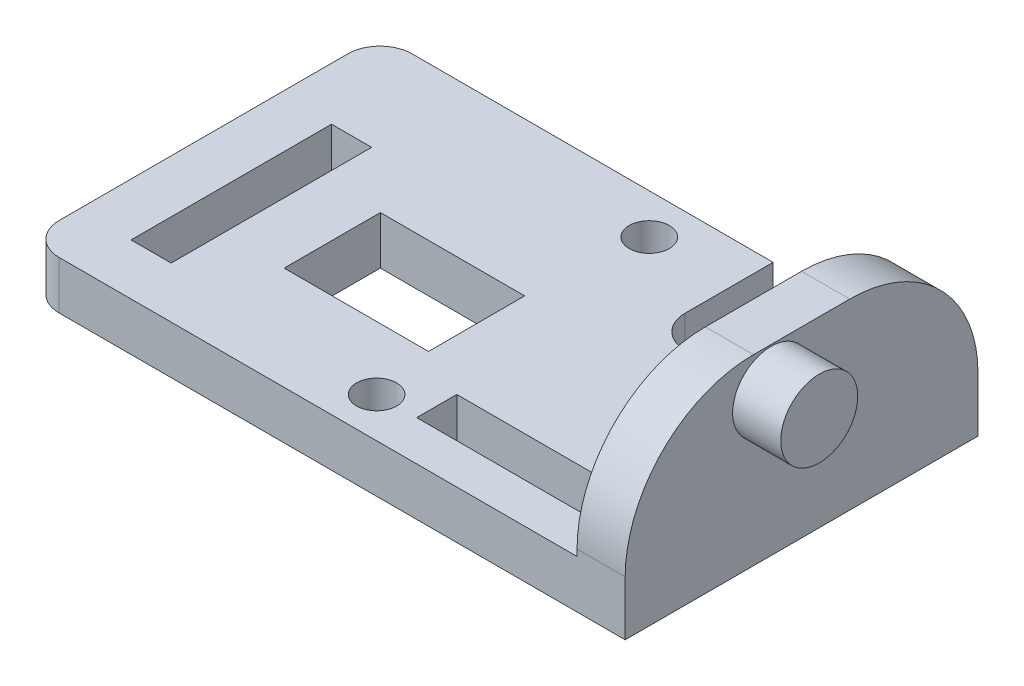
ISO-10303-21;
HEADER;
FILE_DESCRIPTION(('STEP AP214'),'2;1');
FILE_NAME('part.step','',(''),(''),'','','');
FILE_SCHEMA(('AUTOMOTIVE_DESIGN { 1 0 10303 214 1 1 1 1 }'));
ENDSEC;
DATA;
#1=APPLICATION_CONTEXT('core data for automotive mechanical design processes');
#2=APPLICATION_PROTOCOL_DEFINITION('international standard','automotive_design',2000,#1);
#3=PRODUCT_CONTEXT('',#1,'mechanical');
#4=PRODUCT('Part','Part','',(#3));
#5=PRODUCT_RELATED_PRODUCT_CATEGORY('part','',(#4));
#6=PRODUCT_DEFINITION_FORMATION('','',#4);
#7=PRODUCT_DEFINITION_CONTEXT('part definition',#1,'design');
#8=PRODUCT_DEFINITION('design','',#6,#7);
#9=PRODUCT_DEFINITION_SHAPE('','',#8);
#10=(LENGTH_UNIT() NAMED_UNIT(*) SI_UNIT(.MILLI.,.METRE.));
#11=(NAMED_UNIT(*) PLANE_ANGLE_UNIT() SI_UNIT($,.RADIAN.));
#12=(NAMED_UNIT(*) SI_UNIT($,.STERADIAN.) SOLID_ANGLE_UNIT());
#13=UNCERTAINTY_MEASURE_WITH_UNIT(LENGTH_MEASURE(1.E-05),#10,'distance_accuracy_value','');
#14=(GEOMETRIC_REPRESENTATION_CONTEXT(3) GLOBAL_UNCERTAINTY_ASSIGNED_CONTEXT((#13)) GLOBAL_UNIT_ASSIGNED_CONTEXT((#10,
#11,#12)) REPRESENTATION_CONTEXT('',''));
#15=CARTESIAN_POINT('',(0.,0.,0.));
#16=DIRECTION('',(0.,0.,1.));
#17=DIRECTION('',(1.,0.,0.));
#18=AXIS2_PLACEMENT_3D('',#15,#16,#17);
#19=CARTESIAN_POINT('',(0.,3.,0.));
#20=DIRECTION('',(0.,1.,0.));
#21=DIRECTION('',(0.,0.,1.));
#22=AXIS2_PLACEMENT_3D('',#19,#20,#21);
#23=PLANE('',#22);
#24=CARTESIAN_POINT('',(-19.2702207310731,3.,32.1300374848537));
#25=DIRECTION('',(0.,1.,0.));
#26=DIRECTION('',(0.,0.,1.));
#27=AXIS2_PLACEMENT_3D('',#24,#25,#26);
#28=CIRCLE('',#27,1.25);
#29=CARTESIAN_POINT('',(-19.2702207310731,3.,33.3800374848537));
#30=VERTEX_POINT('',#29);
#31=EDGE_CURVE('E872',#30,#30,#28,.F.);
#32=ORIENTED_EDGE('',*,*,#31,.T.);
#33=EDGE_LOOP('',(#32));
#34=FACE_BOUND('',#33,.T.);
#35=DIRECTION('',(0.,0.,1.));
#36=VECTOR('',#35,1.);
#37=CARTESIAN_POINT('',(-4.2702207310731,3.,0.));
#38=LINE('',#37,#36);
#39=CARTESIAN_POINT('',(-4.2702207310731,3.,18.1214427198825));
#40=VERTEX_POINT('',#39);
#41=CARTESIAN_POINT('',(-4.2702207310731,3.,29.6300374848537));
#42=VERTEX_POINT('',#41);
#43=EDGE_CURVE('E378',#40,#42,#38,.T.);
#44=ORIENTED_EDGE('',*,*,#43,.F.);
#45=CARTESIAN_POINT('',(-6.2702207310731,3.,18.1214427198825));
#46=DIRECTION('',(0.,1.,0.));
#47=DIRECTION('',(0.,0.,1.));
#48=AXIS2_PLACEMENT_3D('',#45,#46,#47);
#49=CIRCLE('',#48,2.);
#50=CARTESIAN_POINT('',(-6.2702207310731,3.,20.1214427198825));
#51=VERTEX_POINT('',#50);
#52=EDGE_CURVE('E342',#40,#51,#49,.F.);
#53=ORIENTED_EDGE('',*,*,#52,.T.);
#54=DIRECTION('',(-1.,0.,0.));
#55=VECTOR('',#54,1.);
#56=CARTESIAN_POINT('',(0.,3.,20.1214427198825));
#57=LINE('',#56,#55);
#58=CARTESIAN_POINT('',(-12.0414444487504,3.,20.1214427198825));
#59=VERTEX_POINT('',#58);
#60=EDGE_CURVE('E396',#51,#59,#57,.T.);
#61=ORIENTED_EDGE('',*,*,#60,.T.);
#62=CARTESIAN_POINT('',(-12.0414444487504,3.,18.1214427198825));
#63=DIRECTION('',(0.,1.,0.));
#64=DIRECTION('',(0.,0.,1.));
#65=AXIS2_PLACEMENT_3D('',#62,#63,#64);
#66=CIRCLE('',#65,2.);
#67=CARTESIAN_POINT('',(-14.0414444487504,3.,18.1214427198825));
#68=VERTEX_POINT('',#67);
#69=EDGE_CURVE('E346',#59,#68,#66,.F.);
#70=ORIENTED_EDGE('',*,*,#69,.T.);
#71=DIRECTION('',(0.,0.,1.));
#72=VECTOR('',#71,1.);
#73=CARTESIAN_POINT('',(-14.0414444487504,3.,0.));
#74=LINE('',#73,#72);
#75=CARTESIAN_POINT('',(-14.0414444487504,3.,12.6300374848537));
#76=VERTEX_POINT('',#75);
#77=EDGE_CURVE('E399',#76,#68,#74,.T.);
#78=ORIENTED_EDGE('',*,*,#77,.F.);
#79=DIRECTION('',(1.,0.,0.));
#80=VECTOR('',#79,1.);
#81=CARTESIAN_POINT('',(0.,3.,12.6300374848537));
#82=LINE('',#81,#80);
#83=CARTESIAN_POINT('',(-36.561763485987,3.,12.6300374848537));
#84=VERTEX_POINT('',#83);
#85=EDGE_CURVE('E388',#84,#76,#82,.T.);
#86=ORIENTED_EDGE('',*,*,#85,.F.);
#87=CARTESIAN_POINT('',(-36.561763485987,3.,14.6300374848537));
#88=DIRECTION('',(0.,1.,0.));
#89=DIRECTION('',(0.,0.,1.));
#90=AXIS2_PLACEMENT_3D('',#87,#88,#89);
#91=CIRCLE('',#90,2.);
#92=CARTESIAN_POINT('',(-38.561763485987,3.,14.6300374848537));
#93=VERTEX_POINT('',#92);
#94=EDGE_CURVE('E337',#84,#93,#91,.T.);
#95=ORIENTED_EDGE('',*,*,#94,.T.);
#96=DIRECTION('',(0.,0.,1.));
#97=VECTOR('',#96,1.);
#98=CARTESIAN_POINT('',(-38.561763485987,3.,0.));
#99=LINE('',#98,#97);
#100=CARTESIAN_POINT('',(-38.561763485987,3.,32.6300374848537));
#101=VERTEX_POINT('',#100);
#102=EDGE_CURVE('E390',#93,#101,#99,.T.);
#103=ORIENTED_EDGE('',*,*,#102,.T.);
#104=CARTESIAN_POINT('',(-36.561763485987,3.,32.6300374848537));
#105=DIRECTION('',(0.,1.,0.));
#106=DIRECTION('',(0.,0.,1.));
#107=AXIS2_PLACEMENT_3D('',#104,#105,#106);
#108=CIRCLE('',#107,2.);
#109=CARTESIAN_POINT('',(-36.561763485987,3.,34.6300374848537));
#110=VERTEX_POINT('',#109);
#111=EDGE_CURVE('E335',#101,#110,#108,.T.);
#112=ORIENTED_EDGE('',*,*,#111,.T.);
#113=DIRECTION('',(1.,0.,0.));
#114=VECTOR('',#113,1.);
#115=CARTESIAN_POINT('',(0.,3.,34.6300374848537));
#116=LINE('',#115,#114);
#117=CARTESIAN_POINT('',(-4.2702207310731,3.,34.6300374848537));
#118=VERTEX_POINT('',#117);
#119=EDGE_CURVE('E393',#110,#118,#116,.T.);
#120=ORIENTED_EDGE('',*,*,#119,.T.);
#121=CARTESIAN_POINT('',(-4.2702207310731,3.,32.1300374848537));
#122=VERTEX_POINT('',#121);
#123=EDGE_CURVE('E380',#122,#118,#38,.T.);
#124=ORIENTED_EDGE('',*,*,#123,.F.);
#125=DIRECTION('',(1.,0.,0.));
#126=VECTOR('',#125,1.);
#127=CARTESIAN_POINT('',(0.,3.,32.1300374848537));
#128=LINE('',#127,#126);
#129=CARTESIAN_POINT('',(-16.7702207310731,3.,32.1300374848537));
#130=VERTEX_POINT('',#129);
#131=EDGE_CURVE('E277',#130,#122,#128,.T.);
#132=ORIENTED_EDGE('',*,*,#131,.F.);
#133=DIRECTION('',(0.,0.,-1.));
#134=VECTOR('',#133,1.);
#135=CARTESIAN_POINT('',(-16.7702207310731,3.,0.));
#136=LINE('',#135,#134);
#137=CARTESIAN_POINT('',(-16.7702207310731,3.,29.6300374848537));
#138=VERTEX_POINT('',#137);
#139=EDGE_CURVE('E383',#130,#138,#136,.T.);
#140=ORIENTED_EDGE('',*,*,#139,.T.);
#141=DIRECTION('',(1.,0.,0.));
#142=VECTOR('',#141,1.);
#143=CARTESIAN_POINT('',(0.,3.,29.6300374848537));
#144=LINE('',#143,#142);
#145=EDGE_CURVE('E385',#138,#42,#144,.T.);
#146=ORIENTED_EDGE('',*,*,#145,.T.);
#147=EDGE_LOOP('',(#44,#53,#61,#70,#78,#86,#95,#103,#112,#120,#124,#132,#140,#146));
#148=FACE_BOUND('',#147,.T.);
#149=DIRECTION('',(1.,0.,0.));
#150=VECTOR('',#149,1.);
#151=CARTESIAN_POINT('',(0.,3.,18.9400374848537));
#152=LINE('',#151,#150);
#153=CARTESIAN_POINT('',(-35.2702207310731,3.,18.9400374848537));
#154=VERTEX_POINT('',#153);
#155=CARTESIAN_POINT('',(-32.7702207310731,3.,18.9400374848537));
#156=VERTEX_POINT('',#155);
#157=EDGE_CURVE('E402',#154,#156,#152,.T.);
#158=ORIENTED_EDGE('',*,*,#157,.T.);
#159=DIRECTION('',(0.,0.,1.));
#160=VECTOR('',#159,1.);
#161=CARTESIAN_POINT('',(-32.7702207310731,3.,0.));
#162=LINE('',#161,#160);
#163=CARTESIAN_POINT('',(-32.7702207310731,3.,31.4400374848537));
#164=VERTEX_POINT('',#163);
#165=EDGE_CURVE('E405',#156,#164,#162,.T.);
#166=ORIENTED_EDGE('',*,*,#165,.T.);
#167=DIRECTION('',(1.,0.,0.));
#168=VECTOR('',#167,1.);
#169=CARTESIAN_POINT('',(0.,3.,31.4400374848537));
#170=LINE('',#169,#168);
#171=CARTESIAN_POINT('',(-35.2702207310731,3.,31.4400374848537));
#172=VERTEX_POINT('',#171);
#173=EDGE_CURVE('E407',#172,#164,#170,.T.);
#174=ORIENTED_EDGE('',*,*,#173,.F.);
#175=DIRECTION('',(0.,0.,1.));
#176=VECTOR('',#175,1.);
#177=CARTESIAN_POINT('',(-35.2702207310731,3.,0.));
#178=LINE('',#177,#176);
#179=EDGE_CURVE('E410',#154,#172,#178,.T.);
#180=ORIENTED_EDGE('',*,*,#179,.F.);
#181=EDGE_LOOP('',(#158,#166,#174,#180));
#182=FACE_BOUND('',#181,.T.);
#183=DIRECTION('',(0.,0.,-1.));
#184=VECTOR('',#183,1.);
#185=CARTESIAN_POINT('',(-19.9759075065072,3.,0.));
#186=LINE('',#185,#184);
#187=CARTESIAN_POINT('',(-19.9759075065072,3.,28.1900374848538));
#188=VERTEX_POINT('',#187);
#189=CARTESIAN_POINT('',(-19.9759075065072,3.,22.1900374848537));
#190=VERTEX_POINT('',#189);
#191=EDGE_CURVE('E413',#188,#190,#186,.T.);
#192=ORIENTED_EDGE('',*,*,#191,.F.);
#193=DIRECTION('',(1.,0.,0.));
#194=VECTOR('',#193,1.);
#195=CARTESIAN_POINT('',(0.,3.,28.1900374848538));
#196=LINE('',#195,#194);
#197=CARTESIAN_POINT('',(-28.9759075065072,3.,28.1900374848537));
#198=VERTEX_POINT('',#197);
#199=EDGE_CURVE('E416',#198,#188,#196,.T.);
#200=ORIENTED_EDGE('',*,*,#199,.F.);
#201=DIRECTION('',(0.,0.,-1.));
#202=VECTOR('',#201,1.);
#203=CARTESIAN_POINT('',(-28.9759075065072,3.,0.));
#204=LINE('',#203,#202);
#205=CARTESIAN_POINT('',(-28.9759075065072,3.,22.1900374848537));
#206=VERTEX_POINT('',#205);
#207=EDGE_CURVE('E419',#198,#206,#204,.T.);
#208=ORIENTED_EDGE('',*,*,#207,.T.);
#209=DIRECTION('',(1.,0.,0.));
#210=VECTOR('',#209,1.);
#211=CARTESIAN_POINT('',(0.,3.,22.1900374848537));
#212=LINE('',#211,#210);
#213=EDGE_CURVE('E308',#206,#190,#212,.T.);
#214=ORIENTED_EDGE('',*,*,#213,.T.);
#215=EDGE_LOOP('',(#192,#200,#208,#214));
#216=FACE_BOUND('',#215,.T.);
#217=CARTESIAN_POINT('',(-19.2702207310731,3.,15.1300374848537));
#218=DIRECTION('',(0.,1.,0.));
#219=DIRECTION('',(0.,0.,1.));
#220=AXIS2_PLACEMENT_3D('',#217,#218,#219);
#221=CIRCLE('',#220,1.25);
#222=CARTESIAN_POINT('',(-19.2702207310731,3.,16.3800374848537));
#223=VERTEX_POINT('',#222);
#224=EDGE_CURVE('E861',#223,#223,#221,.F.);
#225=ORIENTED_EDGE('',*,*,#224,.T.);
#226=EDGE_LOOP('',(#225));
#227=FACE_BOUND('',#226,.T.);
#228=ADVANCED_FACE('F34',(#34,#148,#182,#216,#227),#23,.T.);
#229=CARTESIAN_POINT('',(0.,0.,0.));
#230=DIRECTION('',(0.,1.,0.));
#231=DIRECTION('',(0.,0.,1.));
#232=AXIS2_PLACEMENT_3D('',#229,#230,#231);
#233=PLANE('',#232);
#234=CARTESIAN_POINT('',(-19.2702207310731,0.,32.1300374848537));
#235=DIRECTION('',(0.,1.,0.));
#236=DIRECTION('',(0.,0.,1.));
#237=AXIS2_PLACEMENT_3D('',#234,#235,#236);
#238=CIRCLE('',#237,1.25);
#239=CARTESIAN_POINT('',(-19.2702207310731,0.,33.3800374848537));
#240=VERTEX_POINT('',#239);
#241=EDGE_CURVE('E867',#240,#240,#238,.T.);
#242=ORIENTED_EDGE('',*,*,#241,.T.);
#243=EDGE_LOOP('',(#242));
#244=FACE_BOUND('',#243,.T.);
#245=DIRECTION('',(0.,0.,-1.));
#246=VECTOR('',#245,1.);
#247=CARTESIAN_POINT('',(-4.2702207310731,0.,0.));
#248=LINE('',#247,#246);
#249=CARTESIAN_POINT('',(-4.2702207310731,0.,32.1300374848537));
#250=VERTEX_POINT('',#249);
#251=CARTESIAN_POINT('',(-4.2702207310731,0.,29.6300374848537));
#252=VERTEX_POINT('',#251);
#253=EDGE_CURVE('E431',#250,#252,#248,.T.);
#254=ORIENTED_EDGE('',*,*,#253,.T.);
#255=DIRECTION('',(1.,0.,0.));
#256=VECTOR('',#255,1.);
#257=CARTESIAN_POINT('',(0.,0.,29.6300374848537));
#258=LINE('',#257,#256);
#259=CARTESIAN_POINT('',(-16.7702207310731,0.,29.6300374848537));
#260=VERTEX_POINT('',#259);
#261=EDGE_CURVE('E428',#260,#252,#258,.T.);
#262=ORIENTED_EDGE('',*,*,#261,.F.);
#263=DIRECTION('',(0.,0.,-1.));
#264=VECTOR('',#263,1.);
#265=CARTESIAN_POINT('',(-16.7702207310731,0.,0.));
#266=LINE('',#265,#264);
#267=CARTESIAN_POINT('',(-16.7702207310731,0.,32.1300374848537));
#268=VERTEX_POINT('',#267);
#269=EDGE_CURVE('E426',#268,#260,#266,.T.);
#270=ORIENTED_EDGE('',*,*,#269,.F.);
#271=DIRECTION('',(1.,0.,0.));
#272=VECTOR('',#271,1.);
#273=CARTESIAN_POINT('',(0.,0.,32.1300374848537));
#274=LINE('',#273,#272);
#275=EDGE_CURVE('E423',#268,#250,#274,.T.);
#276=ORIENTED_EDGE('',*,*,#275,.T.);
#277=EDGE_LOOP('',(#254,#262,#270,#276));
#278=FACE_BOUND('',#277,.T.);
#279=CARTESIAN_POINT('',(-6.2702207310731,0.,18.1214427198825));
#280=DIRECTION('',(0.,1.,0.));
#281=DIRECTION('',(0.,0.,1.));
#282=AXIS2_PLACEMENT_3D('',#279,#280,#281);
#283=CIRCLE('',#282,2.);
#284=CARTESIAN_POINT('',(-6.2702207310731,0.,20.1214427198825));
#285=VERTEX_POINT('',#284);
#286=CARTESIAN_POINT('',(-4.2702207310731,0.,18.1214427198825));
#287=VERTEX_POINT('',#286);
#288=EDGE_CURVE('E340',#285,#287,#283,.T.);
#289=ORIENTED_EDGE('',*,*,#288,.T.);
#290=DIRECTION('',(0.,0.,-1.));
#291=VECTOR('',#290,1.);
#292=CARTESIAN_POINT('',(-4.2702207310731,0.,0.));
#293=LINE('',#292,#291);
#294=CARTESIAN_POINT('',(-4.2702207310731,0.,12.6300374848537));
#295=VERTEX_POINT('',#294);
#296=EDGE_CURVE('E242',#287,#295,#293,.T.);
#297=ORIENTED_EDGE('',*,*,#296,.T.);
#298=DIRECTION('',(1.,0.,0.));
#299=VECTOR('',#298,1.);
#300=CARTESIAN_POINT('',(0.,0.,12.6300374848537));
#301=LINE('',#300,#299);
#302=CARTESIAN_POINT('',(-1.2702207310731,0.,12.6300374848537));
#303=VERTEX_POINT('',#302);
#304=EDGE_CURVE('E240',#295,#303,#301,.T.);
#305=ORIENTED_EDGE('',*,*,#304,.T.);
#306=DIRECTION('',(0.,0.,1.));
#307=VECTOR('',#306,1.);
#308=CARTESIAN_POINT('',(-1.2702207310731,0.,0.));
#309=LINE('',#308,#307);
#310=CARTESIAN_POINT('',(-1.2702207310731,0.,34.6300374848537));
#311=VERTEX_POINT('',#310);
#312=EDGE_CURVE('E219',#303,#311,#309,.T.);
#313=ORIENTED_EDGE('',*,*,#312,.T.);
#314=DIRECTION('',(1.,0.,0.));
#315=VECTOR('',#314,1.);
#316=CARTESIAN_POINT('',(0.,0.,34.6300374848537));
#317=LINE('',#316,#315);
#318=CARTESIAN_POINT('',(-36.561763485987,0.,34.6300374848537));
#319=VERTEX_POINT('',#318);
#320=EDGE_CURVE('E228',#319,#311,#317,.T.);
#321=ORIENTED_EDGE('',*,*,#320,.F.);
#322=CARTESIAN_POINT('',(-36.561763485987,0.,32.6300374848537));
#323=DIRECTION('',(0.,1.,0.));
#324=DIRECTION('',(0.,0.,1.));
#325=AXIS2_PLACEMENT_3D('',#322,#323,#324);
#326=CIRCLE('',#325,2.);
#327=CARTESIAN_POINT('',(-38.561763485987,0.,32.6300374848537));
#328=VERTEX_POINT('',#327);
#329=EDGE_CURVE('E329',#319,#328,#326,.F.);
#330=ORIENTED_EDGE('',*,*,#329,.T.);
#331=DIRECTION('',(0.,0.,1.));
#332=VECTOR('',#331,1.);
#333=CARTESIAN_POINT('',(-38.561763485987,0.,0.));
#334=LINE('',#333,#332);
#335=CARTESIAN_POINT('',(-38.561763485987,0.,14.6300374848537));
#336=VERTEX_POINT('',#335);
#337=EDGE_CURVE('E234',#336,#328,#334,.T.);
#338=ORIENTED_EDGE('',*,*,#337,.F.);
#339=CARTESIAN_POINT('',(-36.561763485987,0.,14.6300374848537));
#340=DIRECTION('',(0.,1.,0.));
#341=DIRECTION('',(0.,0.,1.));
#342=AXIS2_PLACEMENT_3D('',#339,#340,#341);
#343=CIRCLE('',#342,2.);
#344=CARTESIAN_POINT('',(-36.561763485987,0.,12.6300374848537));
#345=VERTEX_POINT('',#344);
#346=EDGE_CURVE('E331',#336,#345,#343,.F.);
#347=ORIENTED_EDGE('',*,*,#346,.T.);
#348=DIRECTION('',(1.,0.,0.));
#349=VECTOR('',#348,1.);
#350=CARTESIAN_POINT('',(0.,0.,12.6300374848537));
#351=LINE('',#350,#349);
#352=CARTESIAN_POINT('',(-14.0414444487504,0.,12.6300374848537));
#353=VERTEX_POINT('',#352);
#354=EDGE_CURVE('E434',#345,#353,#351,.T.);
#355=ORIENTED_EDGE('',*,*,#354,.T.);
#356=DIRECTION('',(0.,0.,1.));
#357=VECTOR('',#356,1.);
#358=CARTESIAN_POINT('',(-14.0414444487504,0.,0.));
#359=LINE('',#358,#357);
#360=CARTESIAN_POINT('',(-14.0414444487504,0.,18.1214427198825));
#361=VERTEX_POINT('',#360);
#362=EDGE_CURVE('E250',#353,#361,#359,.T.);
#363=ORIENTED_EDGE('',*,*,#362,.T.);
#364=CARTESIAN_POINT('',(-12.0414444487504,0.,18.1214427198825));
#365=DIRECTION('',(0.,1.,0.));
#366=DIRECTION('',(0.,0.,1.));
#367=AXIS2_PLACEMENT_3D('',#364,#365,#366);
#368=CIRCLE('',#367,2.);
#369=CARTESIAN_POINT('',(-12.0414444487504,0.,20.1214427198825));
#370=VERTEX_POINT('',#369);
#371=EDGE_CURVE('E344',#361,#370,#368,.T.);
#372=ORIENTED_EDGE('',*,*,#371,.T.);
#373=DIRECTION('',(-1.,0.,0.));
#374=VECTOR('',#373,1.);
#375=CARTESIAN_POINT('',(0.,0.,20.1214427198825));
#376=LINE('',#375,#374);
#377=EDGE_CURVE('E247',#285,#370,#376,.T.);
#378=ORIENTED_EDGE('',*,*,#377,.F.);
#379=EDGE_LOOP('',(#289,#297,#305,#313,#321,#330,#338,#347,#355,#363,#372,#378));
#380=FACE_BOUND('',#379,.T.);
#381=DIRECTION('',(1.,0.,0.));
#382=VECTOR('',#381,1.);
#383=CARTESIAN_POINT('',(0.,0.,18.9400374848537));
#384=LINE('',#383,#382);
#385=CARTESIAN_POINT('',(-35.2702207310731,0.,18.9400374848537));
#386=VERTEX_POINT('',#385);
#387=CARTESIAN_POINT('',(-32.7702207310731,0.,18.9400374848537));
#388=VERTEX_POINT('',#387);
#389=EDGE_CURVE('E253',#386,#388,#384,.T.);
#390=ORIENTED_EDGE('',*,*,#389,.F.);
#391=DIRECTION('',(0.,0.,1.));
#392=VECTOR('',#391,1.);
#393=CARTESIAN_POINT('',(-35.2702207310731,0.,0.));
#394=LINE('',#393,#392);
#395=CARTESIAN_POINT('',(-35.2702207310731,0.,31.4400374848537));
#396=VERTEX_POINT('',#395);
#397=EDGE_CURVE('E262',#386,#396,#394,.T.);
#398=ORIENTED_EDGE('',*,*,#397,.T.);
#399=DIRECTION('',(1.,0.,0.));
#400=VECTOR('',#399,1.);
#401=CARTESIAN_POINT('',(0.,0.,31.4400374848537));
#402=LINE('',#401,#400);
#403=CARTESIAN_POINT('',(-32.7702207310731,0.,31.4400374848537));
#404=VERTEX_POINT('',#403);
#405=EDGE_CURVE('E259',#396,#404,#402,.T.);
#406=ORIENTED_EDGE('',*,*,#405,.T.);
#407=DIRECTION('',(0.,0.,1.));
#408=VECTOR('',#407,1.);
#409=CARTESIAN_POINT('',(-32.7702207310731,0.,0.));
#410=LINE('',#409,#408);
#411=EDGE_CURVE('E256',#388,#404,#410,.T.);
#412=ORIENTED_EDGE('',*,*,#411,.F.);
#413=EDGE_LOOP('',(#390,#398,#406,#412));
#414=FACE_BOUND('',#413,.T.);
#415=DIRECTION('',(0.,0.,-1.));
#416=VECTOR('',#415,1.);
#417=CARTESIAN_POINT('',(-19.9759075065072,0.,0.));
#418=LINE('',#417,#416);
#419=CARTESIAN_POINT('',(-19.9759075065072,0.,28.1900374848538));
#420=VERTEX_POINT('',#419);
#421=CARTESIAN_POINT('',(-19.9759075065072,0.,22.1900374848537));
#422=VERTEX_POINT('',#421);
#423=EDGE_CURVE('E265',#420,#422,#418,.T.);
#424=ORIENTED_EDGE('',*,*,#423,.T.);
#425=DIRECTION('',(1.,0.,0.));
#426=VECTOR('',#425,1.);
#427=CARTESIAN_POINT('',(0.,0.,22.1900374848537));
#428=LINE('',#427,#426);
#429=CARTESIAN_POINT('',(-28.9759075065072,0.,22.1900374848537));
#430=VERTEX_POINT('',#429);
#431=EDGE_CURVE('E274',#430,#422,#428,.T.);
#432=ORIENTED_EDGE('',*,*,#431,.F.);
#433=DIRECTION('',(0.,0.,-1.));
#434=VECTOR('',#433,1.);
#435=CARTESIAN_POINT('',(-28.9759075065072,0.,0.));
#436=LINE('',#435,#434);
#437=CARTESIAN_POINT('',(-28.9759075065072,0.,28.1900374848537));
#438=VERTEX_POINT('',#437);
#439=EDGE_CURVE('E271',#438,#430,#436,.T.);
#440=ORIENTED_EDGE('',*,*,#439,.F.);
#441=DIRECTION('',(1.,0.,0.));
#442=VECTOR('',#441,1.);
#443=CARTESIAN_POINT('',(0.,0.,28.1900374848538));
#444=LINE('',#443,#442);
#445=EDGE_CURVE('E268',#438,#420,#444,.T.);
#446=ORIENTED_EDGE('',*,*,#445,.T.);
#447=EDGE_LOOP('',(#424,#432,#440,#446));
#448=FACE_BOUND('',#447,.T.);
#449=CARTESIAN_POINT('',(-19.2702207310731,0.,15.1300374848537));
#450=DIRECTION('',(0.,1.,0.));
#451=DIRECTION('',(0.,0.,1.));
#452=AXIS2_PLACEMENT_3D('',#449,#450,#451);
#453=CIRCLE('',#452,1.25);
#454=CARTESIAN_POINT('',(-19.2702207310731,0.,16.3800374848537));
#455=VERTEX_POINT('',#454);
#456=EDGE_CURVE('E864',#455,#455,#453,.T.);
#457=ORIENTED_EDGE('',*,*,#456,.T.);
#458=EDGE_LOOP('',(#457));
#459=FACE_BOUND('',#458,.T.);
#460=ADVANCED_FACE('F236',(#244,#278,#380,#414,#448,#459),#233,.F.);
#461=CARTESIAN_POINT('',(-1.2702207310731,3.,0.));
#462=DIRECTION('',(1.,0.,0.));
#463=DIRECTION('',(0.,0.,-1.));
#464=AXIS2_PLACEMENT_3D('',#461,#462,#463);
#465=PLANE('',#464);
#466=DIRECTION('',(0.,-1.,0.));
#467=VECTOR('',#466,1.);
#468=CARTESIAN_POINT('',(-1.2702207310731,3.,12.6300374848537));
#469=LINE('',#468,#467);
#470=CARTESIAN_POINT('',(-1.2702207310731,3.4,12.6300374848537));
#471=VERTEX_POINT('',#470);
#472=EDGE_CURVE('E292',#471,#303,#469,.T.);
#473=ORIENTED_EDGE('',*,*,#472,.F.);
#474=CARTESIAN_POINT('',(-1.2702207310731,3.4,20.6300374848537));
#475=DIRECTION('',(1.,0.,0.));
#476=DIRECTION('',(0.,0.,-1.));
#477=AXIS2_PLACEMENT_3D('',#474,#475,#476);
#478=CIRCLE('',#477,8.);
#479=CARTESIAN_POINT('',(-1.2702207310731,11.4,20.6300374848537));
#480=VERTEX_POINT('',#479);
#481=EDGE_CURVE('E352',#471,#480,#478,.T.);
#482=ORIENTED_EDGE('',*,*,#481,.T.);
#483=DIRECTION('',(0.,0.,1.));
#484=VECTOR('',#483,1.);
#485=CARTESIAN_POINT('',(-1.2702207310731,11.4,0.));
#486=LINE('',#485,#484);
#487=CARTESIAN_POINT('',(-1.2702207310731,11.4,26.6300374848537));
#488=VERTEX_POINT('',#487);
#489=EDGE_CURVE('E224',#480,#488,#486,.T.);
#490=ORIENTED_EDGE('',*,*,#489,.T.);
#491=CARTESIAN_POINT('',(-1.2702207310731,3.4,26.6300374848537));
#492=DIRECTION('',(1.,0.,0.));
#493=DIRECTION('',(0.,0.,-1.));
#494=AXIS2_PLACEMENT_3D('',#491,#492,#493);
#495=CIRCLE('',#494,8.);
#496=CARTESIAN_POINT('',(-1.2702207310731,3.4,34.6300374848537));
#497=VERTEX_POINT('',#496);
#498=EDGE_CURVE('E222',#488,#497,#495,.T.);
#499=ORIENTED_EDGE('',*,*,#498,.T.);
#500=DIRECTION('',(0.,-1.,0.));
#501=VECTOR('',#500,1.);
#502=CARTESIAN_POINT('',(-1.2702207310731,11.4,34.6300374848537));
#503=LINE('',#502,#501);
#504=EDGE_CURVE('E213',#497,#311,#503,.T.);
#505=ORIENTED_EDGE('',*,*,#504,.T.);
#506=ORIENTED_EDGE('',*,*,#312,.F.);
#507=EDGE_LOOP('',(#473,#482,#490,#499,#505,#506));
#508=FACE_BOUND('',#507,.T.);
#509=CARTESIAN_POINT('',(-1.2702207310731,8.9,25.5300374848537));
#510=DIRECTION('',(1.,0.,0.));
#511=DIRECTION('',(0.,0.,-1.));
#512=AXIS2_PLACEMENT_3D('',#509,#510,#511);
#513=CIRCLE('',#512,2.4);
#514=CARTESIAN_POINT('',(-1.2702207310731,8.9,23.1300374848537));
#515=VERTEX_POINT('',#514);
#516=EDGE_CURVE('E874',#515,#515,#513,.T.);
#517=ORIENTED_EDGE('',*,*,#516,.F.);
#518=EDGE_LOOP('',(#517));
#519=FACE_BOUND('',#518,.T.);
#520=ADVANCED_FACE('F216',(#508,#519),#465,.T.);
#521=CARTESIAN_POINT('',(-19.9759075065072,3.,0.));
#522=DIRECTION('',(-1.,0.,0.));
#523=DIRECTION('',(0.,0.,1.));
#524=AXIS2_PLACEMENT_3D('',#521,#522,#523);
#525=PLANE('',#524);
#526=ORIENTED_EDGE('',*,*,#423,.F.);
#527=DIRECTION('',(0.,-1.,0.));
#528=VECTOR('',#527,1.);
#529=CARTESIAN_POINT('',(-19.9759075065072,3.,28.1900374848538));
#530=LINE('',#529,#528);
#531=EDGE_CURVE('E286',#188,#420,#530,.T.);
#532=ORIENTED_EDGE('',*,*,#531,.F.);
#533=ORIENTED_EDGE('',*,*,#191,.T.);
#534=DIRECTION('',(0.,-1.,0.));
#535=VECTOR('',#534,1.);
#536=CARTESIAN_POINT('',(-19.9759075065072,3.,22.1900374848537));
#537=LINE('',#536,#535);
#538=EDGE_CURVE('E278',#190,#422,#537,.T.);
#539=ORIENTED_EDGE('',*,*,#538,.T.);
#540=EDGE_LOOP('',(#526,#532,#533,#539));
#541=FACE_BOUND('',#540,.T.);
#542=ADVANCED_FACE('F528',(#541),#525,.T.);
#543=CARTESIAN_POINT('',(0.,3.,28.1900374848538));
#544=DIRECTION('',(0.,0.,-1.));
#545=DIRECTION('',(-1.,0.,0.));
#546=AXIS2_PLACEMENT_3D('',#543,#544,#545);
#547=PLANE('',#546);
#548=ORIENTED_EDGE('',*,*,#445,.F.);
#549=DIRECTION('',(0.,-1.,0.));
#550=VECTOR('',#549,1.);
#551=CARTESIAN_POINT('',(-28.9759075065072,3.,28.1900374848537));
#552=LINE('',#551,#550);
#553=EDGE_CURVE('E284',#198,#438,#552,.T.);
#554=ORIENTED_EDGE('',*,*,#553,.F.);
#555=ORIENTED_EDGE('',*,*,#199,.T.);
#556=ORIENTED_EDGE('',*,*,#531,.T.);
#557=EDGE_LOOP('',(#548,#554,#555,#556));
#558=FACE_BOUND('',#557,.T.);
#559=ADVANCED_FACE('F524',(#558),#547,.T.);
#560=CARTESIAN_POINT('',(-28.9759075065072,3.,0.));
#561=DIRECTION('',(-1.,0.,0.));
#562=DIRECTION('',(0.,0.,1.));
#563=AXIS2_PLACEMENT_3D('',#560,#561,#562);
#564=PLANE('',#563);
#565=ORIENTED_EDGE('',*,*,#439,.T.);
#566=DIRECTION('',(0.,-1.,0.));
#567=VECTOR('',#566,1.);
#568=CARTESIAN_POINT('',(-28.9759075065072,3.,22.1900374848537));
#569=LINE('',#568,#567);
#570=EDGE_CURVE('E280',#206,#430,#569,.T.);
#571=ORIENTED_EDGE('',*,*,#570,.F.);
#572=ORIENTED_EDGE('',*,*,#207,.F.);
#573=ORIENTED_EDGE('',*,*,#553,.T.);
#574=EDGE_LOOP('',(#565,#571,#572,#573));
#575=FACE_BOUND('',#574,.T.);
#576=ADVANCED_FACE('F520',(#575),#564,.F.);
#577=CARTESIAN_POINT('',(0.,3.,18.9400374848537));
#578=DIRECTION('',(0.,0.,-1.));
#579=DIRECTION('',(-1.,0.,0.));
#580=AXIS2_PLACEMENT_3D('',#577,#578,#579);
#581=PLANE('',#580);
#582=ORIENTED_EDGE('',*,*,#389,.T.);
#583=DIRECTION('',(0.,-1.,0.));
#584=VECTOR('',#583,1.);
#585=CARTESIAN_POINT('',(-32.7702207310731,3.,18.9400374848537));
#586=LINE('',#585,#584);
#587=EDGE_CURVE('E281',#156,#388,#586,.T.);
#588=ORIENTED_EDGE('',*,*,#587,.F.);
#589=ORIENTED_EDGE('',*,*,#157,.F.);
#590=DIRECTION('',(0.,-1.,0.));
#591=VECTOR('',#590,1.);
#592=CARTESIAN_POINT('',(-35.2702207310731,3.,18.9400374848537));
#593=LINE('',#592,#591);
#594=EDGE_CURVE('E289',#154,#386,#593,.T.);
#595=ORIENTED_EDGE('',*,*,#594,.T.);
#596=EDGE_LOOP('',(#582,#588,#589,#595));
#597=FACE_BOUND('',#596,.T.);
#598=ADVANCED_FACE('F523',(#597),#581,.F.);
#599=CARTESIAN_POINT('',(-32.7702207310731,3.,0.));
#600=DIRECTION('',(1.,0.,0.));
#601=DIRECTION('',(0.,0.,-1.));
#602=AXIS2_PLACEMENT_3D('',#599,#600,#601);
#603=PLANE('',#602);
#604=ORIENTED_EDGE('',*,*,#411,.T.);
#605=DIRECTION('',(0.,-1.,0.));
#606=VECTOR('',#605,1.);
#607=CARTESIAN_POINT('',(-32.7702207310731,3.,31.4400374848537));
#608=LINE('',#607,#606);
#609=EDGE_CURVE('E294',#164,#404,#608,.T.);
#610=ORIENTED_EDGE('',*,*,#609,.F.);
#611=ORIENTED_EDGE('',*,*,#165,.F.);
#612=ORIENTED_EDGE('',*,*,#587,.T.);
#613=EDGE_LOOP('',(#604,#610,#611,#612));
#614=FACE_BOUND('',#613,.T.);
#615=ADVANCED_FACE('F500',(#614),#603,.F.);
#616=CARTESIAN_POINT('',(0.,3.,31.4400374848537));
#617=DIRECTION('',(0.,0.,-1.));
#618=DIRECTION('',(-1.,0.,0.));
#619=AXIS2_PLACEMENT_3D('',#616,#617,#618);
#620=PLANE('',#619);
#621=ORIENTED_EDGE('',*,*,#405,.F.);
#622=DIRECTION('',(0.,-1.,0.));
#623=VECTOR('',#622,1.);
#624=CARTESIAN_POINT('',(-35.2702207310731,3.,31.4400374848537));
#625=LINE('',#624,#623);
#626=EDGE_CURVE('E291',#172,#396,#625,.T.);
#627=ORIENTED_EDGE('',*,*,#626,.F.);
#628=ORIENTED_EDGE('',*,*,#173,.T.);
#629=ORIENTED_EDGE('',*,*,#609,.T.);
#630=EDGE_LOOP('',(#621,#627,#628,#629));
#631=FACE_BOUND('',#630,.T.);
#632=ADVANCED_FACE('F493',(#631),#620,.T.);
#633=CARTESIAN_POINT('',(0.,3.,12.6300374848537));
#634=DIRECTION('',(0.,0.,-1.));
#635=DIRECTION('',(-1.,0.,0.));
#636=AXIS2_PLACEMENT_3D('',#633,#634,#635);
#637=PLANE('',#636);
#638=ORIENTED_EDGE('',*,*,#354,.F.);
#639=DIRECTION('',(0.,-1.,0.));
#640=VECTOR('',#639,1.);
#641=CARTESIAN_POINT('',(-36.561763485987,3.,12.6300374848537));
#642=LINE('',#641,#640);
#643=EDGE_CURVE('E333',#345,#84,#642,.F.);
#644=ORIENTED_EDGE('',*,*,#643,.T.);
#645=ORIENTED_EDGE('',*,*,#85,.T.);
#646=DIRECTION('',(0.,-1.,0.));
#647=VECTOR('',#646,1.);
#648=CARTESIAN_POINT('',(-14.0414444487504,3.,12.6300374848537));
#649=LINE('',#648,#647);
#650=EDGE_CURVE('E298',#76,#353,#649,.T.);
#651=ORIENTED_EDGE('',*,*,#650,.T.);
#652=EDGE_LOOP('',(#638,#644,#645,#651));
#653=FACE_BOUND('',#652,.T.);
#654=ADVANCED_FACE('F491',(#653),#637,.T.);
#655=CARTESIAN_POINT('',(-38.561763485987,3.,0.));
#656=DIRECTION('',(1.,0.,0.));
#657=DIRECTION('',(0.,0.,-1.));
#658=AXIS2_PLACEMENT_3D('',#655,#656,#657);
#659=PLANE('',#658);
#660=ORIENTED_EDGE('',*,*,#102,.F.);
#661=DIRECTION('',(0.,-1.,0.));
#662=VECTOR('',#661,1.);
#663=CARTESIAN_POINT('',(-38.561763485987,0.,14.6300374848537));
#664=LINE('',#663,#662);
#665=EDGE_CURVE('E326',#93,#336,#664,.T.);
#666=ORIENTED_EDGE('',*,*,#665,.T.);
#667=ORIENTED_EDGE('',*,*,#337,.T.);
#668=DIRECTION('',(0.,-1.,0.));
#669=VECTOR('',#668,1.);
#670=CARTESIAN_POINT('',(-38.561763485987,3.,32.6300374848537));
#671=LINE('',#670,#669);
#672=EDGE_CURVE('E324',#328,#101,#671,.F.);
#673=ORIENTED_EDGE('',*,*,#672,.T.);
#674=EDGE_LOOP('',(#660,#666,#667,#673));
#675=FACE_BOUND('',#674,.T.);
#676=ADVANCED_FACE('F440',(#675),#659,.F.);
#677=CARTESIAN_POINT('',(0.,3.,34.6300374848537));
#678=DIRECTION('',(0.,0.,-1.));
#679=DIRECTION('',(-1.,0.,0.));
#680=AXIS2_PLACEMENT_3D('',#677,#678,#679);
#681=PLANE('',#680);
#682=ORIENTED_EDGE('',*,*,#504,.F.);
#683=DIRECTION('',(1.,0.,0.));
#684=VECTOR('',#683,1.);
#685=CARTESIAN_POINT('',(-4.2702207310731,3.4,34.6300374848537));
#686=LINE('',#685,#684);
#687=CARTESIAN_POINT('',(-4.2702207310731,3.4,34.6300374848537));
#688=VERTEX_POINT('',#687);
#689=EDGE_CURVE('E11',#497,#688,#686,.F.);
#690=ORIENTED_EDGE('',*,*,#689,.T.);
#691=DIRECTION('',(0.,-1.,0.));
#692=VECTOR('',#691,1.);
#693=CARTESIAN_POINT('',(-4.2702207310731,11.4,34.6300374848537));
#694=LINE('',#693,#692);
#695=EDGE_CURVE('E223',#688,#118,#694,.T.);
#696=ORIENTED_EDGE('',*,*,#695,.T.);
#697=ORIENTED_EDGE('',*,*,#119,.F.);
#698=DIRECTION('',(0.,-1.,0.));
#699=VECTOR('',#698,1.);
#700=CARTESIAN_POINT('',(-36.561763485987,3.,34.6300374848537));
#701=LINE('',#700,#699);
#702=EDGE_CURVE('E232',#110,#319,#701,.T.);
#703=ORIENTED_EDGE('',*,*,#702,.T.);
#704=ORIENTED_EDGE('',*,*,#320,.T.);
#705=EDGE_LOOP('',(#682,#690,#696,#697,#703,#704));
#706=FACE_BOUND('',#705,.T.);
#707=ADVANCED_FACE('F229',(#706),#681,.F.);
#708=CARTESIAN_POINT('',(0.,3.,12.6300374848537));
#709=DIRECTION('',(0.,0.,-1.));
#710=DIRECTION('',(-1.,0.,0.));
#711=AXIS2_PLACEMENT_3D('',#708,#709,#710);
#712=PLANE('',#711);
#713=DIRECTION('',(0.,-1.,0.));
#714=VECTOR('',#713,1.);
#715=CARTESIAN_POINT('',(-4.2702207310731,3.,12.6300374848537));
#716=LINE('',#715,#714);
#717=CARTESIAN_POINT('',(-4.2702207310731,3.4,12.6300374848537));
#718=VERTEX_POINT('',#717);
#719=EDGE_CURVE('E301',#718,#295,#716,.T.);
#720=ORIENTED_EDGE('',*,*,#719,.F.);
#721=DIRECTION('',(1.,0.,0.));
#722=VECTOR('',#721,1.);
#723=CARTESIAN_POINT('',(0.,3.4,12.6300374848537));
#724=LINE('',#723,#722);
#725=EDGE_CURVE('E348',#718,#471,#724,.T.);
#726=ORIENTED_EDGE('',*,*,#725,.T.);
#727=ORIENTED_EDGE('',*,*,#472,.T.);
#728=ORIENTED_EDGE('',*,*,#304,.F.);
#729=EDGE_LOOP('',(#720,#726,#727,#728));
#730=FACE_BOUND('',#729,.T.);
#731=ADVANCED_FACE('F368',(#730),#712,.T.);
#732=CARTESIAN_POINT('',(-4.2702207310731,3.,0.));
#733=DIRECTION('',(-1.,0.,0.));
#734=DIRECTION('',(0.,0.,1.));
#735=AXIS2_PLACEMENT_3D('',#732,#733,#734);
#736=PLANE('',#735);
#737=DIRECTION('',(0.,0.,-1.));
#738=VECTOR('',#737,1.);
#739=CARTESIAN_POINT('',(-4.2702207310731,11.4,0.));
#740=LINE('',#739,#738);
#741=CARTESIAN_POINT('',(-4.2702207310731,11.4,26.6300374848537));
#742=VERTEX_POINT('',#741);
#743=CARTESIAN_POINT('',(-4.2702207310731,11.4,20.6300374848537));
#744=VERTEX_POINT('',#743);
#745=EDGE_CURVE('E364',#742,#744,#740,.T.);
#746=ORIENTED_EDGE('',*,*,#745,.T.);
#747=CARTESIAN_POINT('',(-4.2702207310731,3.4,20.6300374848537));
#748=DIRECTION('',(-1.,0.,0.));
#749=DIRECTION('',(0.,0.,1.));
#750=AXIS2_PLACEMENT_3D('',#747,#748,#749);
#751=CIRCLE('',#750,8.);
#752=EDGE_CURVE('E42',#744,#718,#751,.T.);
#753=ORIENTED_EDGE('',*,*,#752,.T.);
#754=ORIENTED_EDGE('',*,*,#719,.T.);
#755=ORIENTED_EDGE('',*,*,#296,.F.);
#756=DIRECTION('',(0.,-1.,0.));
#757=VECTOR('',#756,1.);
#758=CARTESIAN_POINT('',(-4.2702207310731,3.,18.1214427198825));
#759=LINE('',#758,#757);
#760=EDGE_CURVE('E318',#287,#40,#759,.F.);
#761=ORIENTED_EDGE('',*,*,#760,.T.);
#762=ORIENTED_EDGE('',*,*,#43,.T.);
#763=DIRECTION('',(0.,-1.,0.));
#764=VECTOR('',#763,1.);
#765=CARTESIAN_POINT('',(-4.2702207310731,3.,29.6300374848537));
#766=LINE('',#765,#764);
#767=EDGE_CURVE('E307',#42,#252,#766,.T.);
#768=ORIENTED_EDGE('',*,*,#767,.T.);
#769=ORIENTED_EDGE('',*,*,#253,.F.);
#770=DIRECTION('',(0.,-1.,0.));
#771=VECTOR('',#770,1.);
#772=CARTESIAN_POINT('',(-4.2702207310731,3.,32.1300374848537));
#773=LINE('',#772,#771);
#774=EDGE_CURVE('E305',#122,#250,#773,.T.);
#775=ORIENTED_EDGE('',*,*,#774,.F.);
#776=ORIENTED_EDGE('',*,*,#123,.T.);
#777=ORIENTED_EDGE('',*,*,#695,.F.);
#778=CARTESIAN_POINT('',(-4.2702207310731,3.4,26.6300374848537));
#779=DIRECTION('',(-1.,0.,0.));
#780=DIRECTION('',(0.,0.,1.));
#781=AXIS2_PLACEMENT_3D('',#778,#779,#780);
#782=CIRCLE('',#781,8.);
#783=EDGE_CURVE('E358',#688,#742,#782,.T.);
#784=ORIENTED_EDGE('',*,*,#783,.T.);
#785=EDGE_LOOP('',(#746,#753,#754,#755,#761,#762,#768,#769,#775,#776,#777,#784));
#786=FACE_BOUND('',#785,.T.);
#787=ADVANCED_FACE('F362',(#786),#736,.T.);
#788=CARTESIAN_POINT('',(0.,3.,20.1214427198825));
#789=DIRECTION('',(0.,0.,1.));
#790=DIRECTION('',(1.,0.,0.));
#791=AXIS2_PLACEMENT_3D('',#788,#789,#790);
#792=PLANE('',#791);
#793=ORIENTED_EDGE('',*,*,#60,.F.);
#794=DIRECTION('',(0.,-1.,0.));
#795=VECTOR('',#794,1.);
#796=CARTESIAN_POINT('',(-6.2702207310731,3.,20.1214427198825));
#797=LINE('',#796,#795);
#798=EDGE_CURVE('E315',#51,#285,#797,.T.);
#799=ORIENTED_EDGE('',*,*,#798,.T.);
#800=ORIENTED_EDGE('',*,*,#377,.T.);
#801=DIRECTION('',(0.,-1.,0.));
#802=VECTOR('',#801,1.);
#803=CARTESIAN_POINT('',(-12.0414444487504,3.,20.1214427198825));
#804=LINE('',#803,#802);
#805=EDGE_CURVE('E288',#370,#59,#804,.F.);
#806=ORIENTED_EDGE('',*,*,#805,.T.);
#807=EDGE_LOOP('',(#793,#799,#800,#806));
#808=FACE_BOUND('',#807,.T.);
#809=ADVANCED_FACE('F473',(#808),#792,.F.);
#810=CARTESIAN_POINT('',(0.,3.,32.1300374848537));
#811=DIRECTION('',(0.,0.,-1.));
#812=DIRECTION('',(-1.,0.,0.));
#813=AXIS2_PLACEMENT_3D('',#810,#811,#812);
#814=PLANE('',#813);
#815=ORIENTED_EDGE('',*,*,#275,.F.);
#816=DIRECTION('',(0.,-1.,0.));
#817=VECTOR('',#816,1.);
#818=CARTESIAN_POINT('',(-16.7702207310731,3.,32.1300374848537));
#819=LINE('',#818,#817);
#820=EDGE_CURVE('E302',#130,#268,#819,.T.);
#821=ORIENTED_EDGE('',*,*,#820,.F.);
#822=ORIENTED_EDGE('',*,*,#131,.T.);
#823=ORIENTED_EDGE('',*,*,#774,.T.);
#824=EDGE_LOOP('',(#815,#821,#822,#823));
#825=FACE_BOUND('',#824,.T.);
#826=ADVANCED_FACE('F456',(#825),#814,.T.);
#827=CARTESIAN_POINT('',(-16.7702207310731,3.,0.));
#828=DIRECTION('',(-1.,0.,0.));
#829=DIRECTION('',(0.,0.,1.));
#830=AXIS2_PLACEMENT_3D('',#827,#828,#829);
#831=PLANE('',#830);
#832=ORIENTED_EDGE('',*,*,#269,.T.);
#833=DIRECTION('',(0.,-1.,0.));
#834=VECTOR('',#833,1.);
#835=CARTESIAN_POINT('',(-16.7702207310731,3.,29.6300374848537));
#836=LINE('',#835,#834);
#837=EDGE_CURVE('E310',#138,#260,#836,.T.);
#838=ORIENTED_EDGE('',*,*,#837,.F.);
#839=ORIENTED_EDGE('',*,*,#139,.F.);
#840=ORIENTED_EDGE('',*,*,#820,.T.);
#841=EDGE_LOOP('',(#832,#838,#839,#840));
#842=FACE_BOUND('',#841,.T.);
#843=ADVANCED_FACE('F459',(#842),#831,.F.);
#844=CARTESIAN_POINT('',(0.,3.,29.6300374848537));
#845=DIRECTION('',(0.,0.,-1.));
#846=DIRECTION('',(-1.,0.,0.));
#847=AXIS2_PLACEMENT_3D('',#844,#845,#846);
#848=PLANE('',#847);
#849=ORIENTED_EDGE('',*,*,#261,.T.);
#850=ORIENTED_EDGE('',*,*,#767,.F.);
#851=ORIENTED_EDGE('',*,*,#145,.F.);
#852=ORIENTED_EDGE('',*,*,#837,.T.);
#853=EDGE_LOOP('',(#849,#850,#851,#852));
#854=FACE_BOUND('',#853,.T.);
#855=ADVANCED_FACE('F464',(#854),#848,.F.);
#856=CARTESIAN_POINT('',(-35.2702207310731,3.,0.));
#857=DIRECTION('',(1.,0.,0.));
#858=DIRECTION('',(0.,0.,-1.));
#859=AXIS2_PLACEMENT_3D('',#856,#857,#858);
#860=PLANE('',#859);
#861=ORIENTED_EDGE('',*,*,#397,.F.);
#862=ORIENTED_EDGE('',*,*,#594,.F.);
#863=ORIENTED_EDGE('',*,*,#179,.T.);
#864=ORIENTED_EDGE('',*,*,#626,.T.);
#865=EDGE_LOOP('',(#861,#862,#863,#864));
#866=FACE_BOUND('',#865,.T.);
#867=ADVANCED_FACE('F533',(#866),#860,.T.);
#868=CARTESIAN_POINT('',(-14.0414444487504,3.,0.));
#869=DIRECTION('',(1.,0.,0.));
#870=DIRECTION('',(0.,0.,-1.));
#871=AXIS2_PLACEMENT_3D('',#868,#869,#870);
#872=PLANE('',#871);
#873=ORIENTED_EDGE('',*,*,#77,.T.);
#874=DIRECTION('',(0.,-1.,0.));
#875=VECTOR('',#874,1.);
#876=CARTESIAN_POINT('',(-14.0414444487504,3.,18.1214427198825));
#877=LINE('',#876,#875);
#878=EDGE_CURVE('E321',#68,#361,#877,.T.);
#879=ORIENTED_EDGE('',*,*,#878,.T.);
#880=ORIENTED_EDGE('',*,*,#362,.F.);
#881=ORIENTED_EDGE('',*,*,#650,.F.);
#882=EDGE_LOOP('',(#873,#879,#880,#881));
#883=FACE_BOUND('',#882,.T.);
#884=ADVANCED_FACE('F481',(#883),#872,.T.);
#885=CARTESIAN_POINT('',(0.,3.,22.1900374848537));
#886=DIRECTION('',(0.,0.,-1.));
#887=DIRECTION('',(-1.,0.,0.));
#888=AXIS2_PLACEMENT_3D('',#885,#886,#887);
#889=PLANE('',#888);
#890=ORIENTED_EDGE('',*,*,#431,.T.);
#891=ORIENTED_EDGE('',*,*,#538,.F.);
#892=ORIENTED_EDGE('',*,*,#213,.F.);
#893=ORIENTED_EDGE('',*,*,#570,.T.);
#894=EDGE_LOOP('',(#890,#891,#892,#893));
#895=FACE_BOUND('',#894,.T.);
#896=ADVANCED_FACE('F516',(#895),#889,.F.);
#897=CARTESIAN_POINT('',(-6.2702207310731,3.,18.1214427198825));
#898=DIRECTION('',(0.,-1.,0.));
#899=DIRECTION('',(0.,0.,-1.));
#900=AXIS2_PLACEMENT_3D('',#897,#898,#899);
#901=CYLINDRICAL_SURFACE('',#900,2.);
#902=ORIENTED_EDGE('',*,*,#52,.F.);
#903=ORIENTED_EDGE('',*,*,#760,.F.);
#904=ORIENTED_EDGE('',*,*,#288,.F.);
#905=ORIENTED_EDGE('',*,*,#798,.F.);
#906=EDGE_LOOP('',(#902,#903,#904,#905));
#907=FACE_BOUND('',#906,.T.);
#908=ADVANCED_FACE('F470',(#907),#901,.F.);
#909=CARTESIAN_POINT('',(-12.0414444487504,3.,18.1214427198825));
#910=DIRECTION('',(0.,-1.,0.));
#911=DIRECTION('',(0.,0.,-1.));
#912=AXIS2_PLACEMENT_3D('',#909,#910,#911);
#913=CYLINDRICAL_SURFACE('',#912,2.);
#914=ORIENTED_EDGE('',*,*,#69,.F.);
#915=ORIENTED_EDGE('',*,*,#805,.F.);
#916=ORIENTED_EDGE('',*,*,#371,.F.);
#917=ORIENTED_EDGE('',*,*,#878,.F.);
#918=EDGE_LOOP('',(#914,#915,#916,#917));
#919=FACE_BOUND('',#918,.T.);
#920=ADVANCED_FACE('F479',(#919),#913,.F.);
#921=CARTESIAN_POINT('',(-36.561763485987,3.,14.6300374848537));
#922=DIRECTION('',(0.,1.,0.));
#923=DIRECTION('',(0.,0.,1.));
#924=AXIS2_PLACEMENT_3D('',#921,#922,#923);
#925=CYLINDRICAL_SURFACE('',#924,2.);
#926=ORIENTED_EDGE('',*,*,#94,.F.);
#927=ORIENTED_EDGE('',*,*,#643,.F.);
#928=ORIENTED_EDGE('',*,*,#346,.F.);
#929=ORIENTED_EDGE('',*,*,#665,.F.);
#930=EDGE_LOOP('',(#926,#927,#928,#929));
#931=FACE_BOUND('',#930,.T.);
#932=ADVANCED_FACE('F489',(#931),#925,.T.);
#933=CARTESIAN_POINT('',(-36.561763485987,3.,32.6300374848537));
#934=DIRECTION('',(0.,-1.,0.));
#935=DIRECTION('',(0.,0.,-1.));
#936=AXIS2_PLACEMENT_3D('',#933,#934,#935);
#937=CYLINDRICAL_SURFACE('',#936,2.);
#938=ORIENTED_EDGE('',*,*,#111,.F.);
#939=ORIENTED_EDGE('',*,*,#672,.F.);
#940=ORIENTED_EDGE('',*,*,#329,.F.);
#941=ORIENTED_EDGE('',*,*,#702,.F.);
#942=EDGE_LOOP('',(#938,#939,#940,#941));
#943=FACE_BOUND('',#942,.T.);
#944=ADVANCED_FACE('F444',(#943),#937,.T.);
#945=CARTESIAN_POINT('',(0.,11.4,0.));
#946=DIRECTION('',(0.,1.,0.));
#947=DIRECTION('',(0.,0.,1.));
#948=AXIS2_PLACEMENT_3D('',#945,#946,#947);
#949=PLANE('',#948);
#950=ORIENTED_EDGE('',*,*,#489,.F.);
#951=DIRECTION('',(1.,0.,0.));
#952=VECTOR('',#951,1.);
#953=CARTESIAN_POINT('',(0.,11.4,20.6300374848537));
#954=LINE('',#953,#952);
#955=EDGE_CURVE('E55',#480,#744,#954,.F.);
#956=ORIENTED_EDGE('',*,*,#955,.T.);
#957=ORIENTED_EDGE('',*,*,#745,.F.);
#958=DIRECTION('',(1.,0.,0.));
#959=VECTOR('',#958,1.);
#960=CARTESIAN_POINT('',(-1.2702207310731,11.4,26.6300374848537));
#961=LINE('',#960,#959);
#962=EDGE_CURVE('E354',#742,#488,#961,.T.);
#963=ORIENTED_EDGE('',*,*,#962,.T.);
#964=EDGE_LOOP('',(#950,#956,#957,#963));
#965=FACE_BOUND('',#964,.T.);
#966=ADVANCED_FACE('F370',(#965),#949,.T.);
#967=CARTESIAN_POINT('',(1.7297792689269,8.9,25.5300374848537));
#968=DIRECTION('',(-1.,0.,0.));
#969=DIRECTION('',(0.,0.,1.));
#970=AXIS2_PLACEMENT_3D('',#967,#968,#969);
#971=CYLINDRICAL_SURFACE('',#970,2.4);
#972=CARTESIAN_POINT('',(1.7297792689269,8.9,25.5300374848537));
#973=DIRECTION('',(1.,0.,0.));
#974=DIRECTION('',(0.,0.,-1.));
#975=AXIS2_PLACEMENT_3D('',#972,#973,#974);
#976=CIRCLE('',#975,2.4);
#977=CARTESIAN_POINT('',(1.7297792689269,8.9,23.1300374848537));
#978=VERTEX_POINT('',#977);
#979=EDGE_CURVE('E373',#978,#978,#976,.T.);
#980=ORIENTED_EDGE('',*,*,#979,.F.);
#981=EDGE_LOOP('',(#980));
#982=FACE_BOUND('',#981,.T.);
#983=ORIENTED_EDGE('',*,*,#516,.T.);
#984=EDGE_LOOP('',(#983));
#985=FACE_BOUND('',#984,.T.);
#986=ADVANCED_FACE('F632',(#982,#985),#971,.T.);
#987=CARTESIAN_POINT('',(1.7297792689269,8.9,25.5300374848537));
#988=DIRECTION('',(1.,0.,0.));
#989=DIRECTION('',(0.,0.,-1.));
#990=AXIS2_PLACEMENT_3D('',#987,#988,#989);
#991=PLANE('',#990);
#992=ORIENTED_EDGE('',*,*,#979,.T.);
#993=EDGE_LOOP('',(#992));
#994=FACE_BOUND('',#993,.T.);
#995=ADVANCED_FACE('F638',(#994),#991,.T.);
#996=CARTESIAN_POINT('',(0.,3.4,20.6300374848537));
#997=DIRECTION('',(1.,0.,0.));
#998=DIRECTION('',(0.,0.,-1.));
#999=AXIS2_PLACEMENT_3D('',#996,#997,#998);
#1000=CYLINDRICAL_SURFACE('',#999,8.);
#1001=ORIENTED_EDGE('',*,*,#752,.F.);
#1002=ORIENTED_EDGE('',*,*,#955,.F.);
#1003=ORIENTED_EDGE('',*,*,#481,.F.);
#1004=ORIENTED_EDGE('',*,*,#725,.F.);
#1005=EDGE_LOOP('',(#1001,#1002,#1003,#1004));
#1006=FACE_BOUND('',#1005,.T.);
#1007=ADVANCED_FACE('F369',(#1006),#1000,.T.);
#1008=CARTESIAN_POINT('',(0.,3.4,26.6300374848537));
#1009=DIRECTION('',(-1.,0.,0.));
#1010=DIRECTION('',(0.,0.,1.));
#1011=AXIS2_PLACEMENT_3D('',#1008,#1009,#1010);
#1012=CYLINDRICAL_SURFACE('',#1011,8.);
#1013=ORIENTED_EDGE('',*,*,#783,.F.);
#1014=ORIENTED_EDGE('',*,*,#689,.F.);
#1015=ORIENTED_EDGE('',*,*,#498,.F.);
#1016=ORIENTED_EDGE('',*,*,#962,.F.);
#1017=EDGE_LOOP('',(#1013,#1014,#1015,#1016));
#1018=FACE_BOUND('',#1017,.T.);
#1019=ADVANCED_FACE('F36',(#1018),#1012,.T.);
#1020=CARTESIAN_POINT('',(-19.2702207310731,11.4,32.1300374848537));
#1021=DIRECTION('',(0.,-1.,0.));
#1022=DIRECTION('',(0.,0.,-1.));
#1023=AXIS2_PLACEMENT_3D('',#1020,#1021,#1022);
#1024=CYLINDRICAL_SURFACE('',#1023,1.25);
#1025=ORIENTED_EDGE('',*,*,#31,.F.);
#1026=EDGE_LOOP('',(#1025));
#1027=FACE_BOUND('',#1026,.T.);
#1028=ORIENTED_EDGE('',*,*,#241,.F.);
#1029=EDGE_LOOP('',(#1028));
#1030=FACE_BOUND('',#1029,.T.);
#1031=ADVANCED_FACE('F656',(#1027,#1030),#1024,.F.);
#1032=CARTESIAN_POINT('',(-19.2702207310731,11.4,15.1300374848537));
#1033=DIRECTION('',(0.,-1.,0.));
#1034=DIRECTION('',(0.,0.,-1.));
#1035=AXIS2_PLACEMENT_3D('',#1032,#1033,#1034);
#1036=CYLINDRICAL_SURFACE('',#1035,1.25);
#1037=ORIENTED_EDGE('',*,*,#224,.F.);
#1038=EDGE_LOOP('',(#1037));
#1039=FACE_BOUND('',#1038,.T.);
#1040=ORIENTED_EDGE('',*,*,#456,.F.);
#1041=EDGE_LOOP('',(#1040));
#1042=FACE_BOUND('',#1041,.T.);
#1043=ADVANCED_FACE('F663',(#1039,#1042),#1036,.F.);
#1044=CLOSED_SHELL('',(#228,#460,#520,#542,#559,#576,#598,#615,#632,#654,#676,#707,#731,#787,
#809,#826,#843,#855,#867,#884,#896,#908,#920,#932,#944,#966,#986,#995,#1007,#1019,#1031,#1043));
#1045=MANIFOLD_SOLID_BREP('B2',#1044);
#1046=ADVANCED_BREP_SHAPE_REPRESENTATION('',(#18,#1045),#14);
#1047=SHAPE_DEFINITION_REPRESENTATION(#9,#1046);
ENDSEC;
END-ISO-10303-21;
